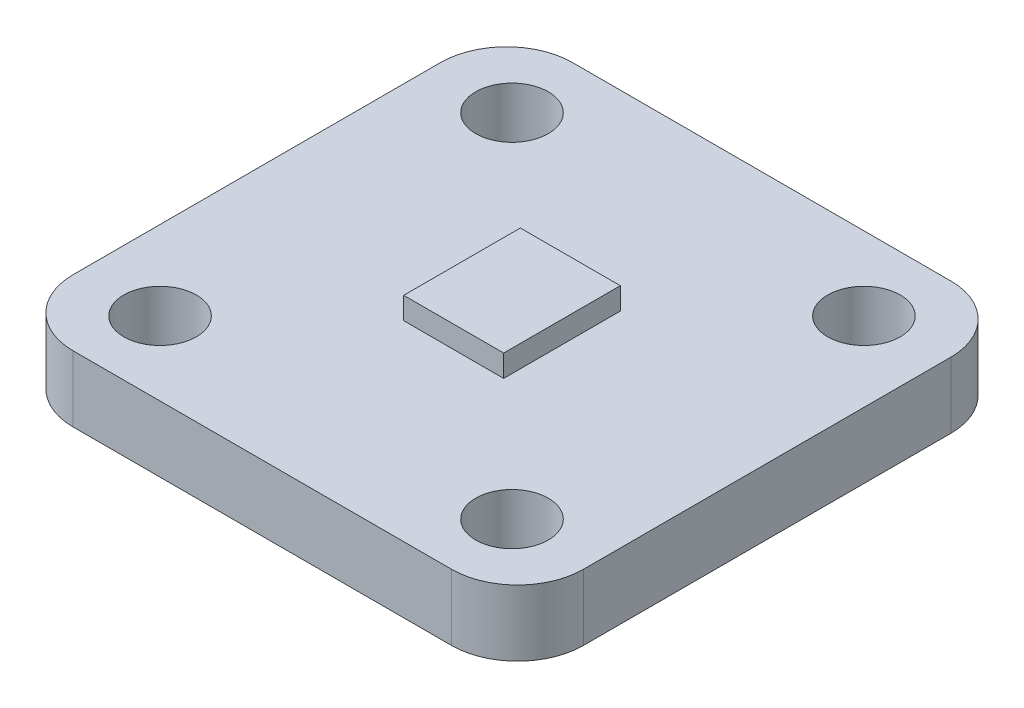
ISO-10303-21;
HEADER;
FILE_DESCRIPTION(('STEP AP214'),'2;1');
FILE_NAME('part.step','',(''),(''),'','','');
FILE_SCHEMA(('AUTOMOTIVE_DESIGN { 1 0 10303 214 1 1 1 1 }'));
ENDSEC;
DATA;
#1=APPLICATION_CONTEXT('core data for automotive mechanical design processes');
#2=APPLICATION_PROTOCOL_DEFINITION('international standard','automotive_design',2000,#1);
#3=PRODUCT_CONTEXT('',#1,'mechanical');
#4=PRODUCT('Part','Part','',(#3));
#5=PRODUCT_RELATED_PRODUCT_CATEGORY('part','',(#4));
#6=PRODUCT_DEFINITION_FORMATION('','',#4);
#7=PRODUCT_DEFINITION_CONTEXT('part definition',#1,'design');
#8=PRODUCT_DEFINITION('design','',#6,#7);
#9=PRODUCT_DEFINITION_SHAPE('','',#8);
#10=(LENGTH_UNIT() NAMED_UNIT(*) SI_UNIT(.MILLI.,.METRE.));
#11=(NAMED_UNIT(*) PLANE_ANGLE_UNIT() SI_UNIT($,.RADIAN.));
#12=(NAMED_UNIT(*) SI_UNIT($,.STERADIAN.) SOLID_ANGLE_UNIT());
#13=UNCERTAINTY_MEASURE_WITH_UNIT(LENGTH_MEASURE(1.E-05),#10,'distance_accuracy_value','');
#14=(GEOMETRIC_REPRESENTATION_CONTEXT(3) GLOBAL_UNCERTAINTY_ASSIGNED_CONTEXT((#13)) GLOBAL_UNIT_ASSIGNED_CONTEXT((#10,
#11,#12)) REPRESENTATION_CONTEXT('',''));
#15=CARTESIAN_POINT('',(0.,0.,0.));
#16=DIRECTION('',(0.,0.,1.));
#17=DIRECTION('',(1.,0.,0.));
#18=AXIS2_PLACEMENT_3D('',#15,#16,#17);
#19=CARTESIAN_POINT('',(0.,3.,0.));
#20=DIRECTION('',(0.,1.,0.));
#21=DIRECTION('',(0.,0.,1.));
#22=AXIS2_PLACEMENT_3D('',#19,#20,#21);
#23=PLANE('',#22);
#24=CARTESIAN_POINT('',(8.,3.,8.));
#25=DIRECTION('',(0.,1.,0.));
#26=DIRECTION('',(0.,0.,1.));
#27=AXIS2_PLACEMENT_3D('',#24,#25,#26);
#28=CIRCLE('',#27,1.65);
#29=CARTESIAN_POINT('',(8.,3.,9.65));
#30=VERTEX_POINT('',#29);
#31=EDGE_CURVE('E171',#30,#30,#28,.T.);
#32=ORIENTED_EDGE('',*,*,#31,.F.);
#33=EDGE_LOOP('',(#32));
#34=FACE_BOUND('',#33,.T.);
#35=CARTESIAN_POINT('',(-8.,3.,-8.));
#36=DIRECTION('',(0.,1.,0.));
#37=DIRECTION('',(0.,0.,1.));
#38=AXIS2_PLACEMENT_3D('',#35,#36,#37);
#39=CIRCLE('',#38,1.65);
#40=CARTESIAN_POINT('',(-8.,3.,-6.35));
#41=VERTEX_POINT('',#40);
#42=EDGE_CURVE('E187',#41,#41,#39,.T.);
#43=ORIENTED_EDGE('',*,*,#42,.F.);
#44=EDGE_LOOP('',(#43));
#45=FACE_BOUND('',#44,.T.);
#46=DIRECTION('',(-1.,0.,0.));
#47=VECTOR('',#46,1.);
#48=CARTESIAN_POINT('',(-11.6,3.,-11.35));
#49=LINE('',#48,#47);
#50=CARTESIAN_POINT('',(8.59999999999999,3.,-11.35));
#51=VERTEX_POINT('',#50);
#52=CARTESIAN_POINT('',(-8.6,3.,-11.35));
#53=VERTEX_POINT('',#52);
#54=EDGE_CURVE('E199',#51,#53,#49,.T.);
#55=ORIENTED_EDGE('',*,*,#54,.T.);
#56=CARTESIAN_POINT('',(-8.6,3.,-8.35));
#57=DIRECTION('',(0.,1.,0.));
#58=DIRECTION('',(0.,0.,1.));
#59=AXIS2_PLACEMENT_3D('',#56,#57,#58);
#60=CIRCLE('',#59,3.);
#61=CARTESIAN_POINT('',(-11.6,3.,-8.35));
#62=VERTEX_POINT('',#61);
#63=EDGE_CURVE('E259',#53,#62,#60,.T.);
#64=ORIENTED_EDGE('',*,*,#63,.T.);
#65=DIRECTION('',(0.,0.,1.));
#66=VECTOR('',#65,1.);
#67=CARTESIAN_POINT('',(-11.6,3.,-11.35));
#68=LINE('',#67,#66);
#69=CARTESIAN_POINT('',(-11.6,3.,8.35));
#70=VERTEX_POINT('',#69);
#71=EDGE_CURVE('E204',#62,#70,#68,.T.);
#72=ORIENTED_EDGE('',*,*,#71,.T.);
#73=CARTESIAN_POINT('',(-8.6,3.,8.35));
#74=DIRECTION('',(0.,1.,0.));
#75=DIRECTION('',(0.,0.,1.));
#76=AXIS2_PLACEMENT_3D('',#73,#74,#75);
#77=CIRCLE('',#76,3.);
#78=CARTESIAN_POINT('',(-8.6,3.,11.35));
#79=VERTEX_POINT('',#78);
#80=EDGE_CURVE('E250',#70,#79,#77,.T.);
#81=ORIENTED_EDGE('',*,*,#80,.T.);
#82=DIRECTION('',(1.,0.,0.));
#83=VECTOR('',#82,1.);
#84=CARTESIAN_POINT('',(-11.6,3.,11.35));
#85=LINE('',#84,#83);
#86=CARTESIAN_POINT('',(8.6,3.,11.35));
#87=VERTEX_POINT('',#86);
#88=EDGE_CURVE('E208',#79,#87,#85,.T.);
#89=ORIENTED_EDGE('',*,*,#88,.T.);
#90=CARTESIAN_POINT('',(8.6,3.,8.35));
#91=DIRECTION('',(0.,1.,0.));
#92=DIRECTION('',(0.,0.,1.));
#93=AXIS2_PLACEMENT_3D('',#90,#91,#92);
#94=CIRCLE('',#93,3.);
#95=CARTESIAN_POINT('',(11.6,3.,8.35));
#96=VERTEX_POINT('',#95);
#97=EDGE_CURVE('E253',#87,#96,#94,.T.);
#98=ORIENTED_EDGE('',*,*,#97,.T.);
#99=DIRECTION('',(0.,0.,-1.));
#100=VECTOR('',#99,1.);
#101=CARTESIAN_POINT('',(11.6,3.,-11.35));
#102=LINE('',#101,#100);
#103=CARTESIAN_POINT('',(11.6,3.,-8.35));
#104=VERTEX_POINT('',#103);
#105=EDGE_CURVE('E195',#96,#104,#102,.T.);
#106=ORIENTED_EDGE('',*,*,#105,.T.);
#107=CARTESIAN_POINT('',(8.59999999999999,3.,-8.35));
#108=DIRECTION('',(0.,1.,0.));
#109=DIRECTION('',(0.,0.,1.));
#110=AXIS2_PLACEMENT_3D('',#107,#108,#109);
#111=CIRCLE('',#110,3.);
#112=EDGE_CURVE('E256',#104,#51,#111,.T.);
#113=ORIENTED_EDGE('',*,*,#112,.T.);
#114=EDGE_LOOP('',(#55,#64,#72,#81,#89,#98,#106,#113));
#115=FACE_BOUND('',#114,.T.);
#116=CARTESIAN_POINT('',(8.,3.,-8.));
#117=DIRECTION('',(0.,1.,0.));
#118=DIRECTION('',(0.,0.,1.));
#119=AXIS2_PLACEMENT_3D('',#116,#117,#118);
#120=CIRCLE('',#119,1.65);
#121=CARTESIAN_POINT('',(8.,3.,-6.35));
#122=VERTEX_POINT('',#121);
#123=EDGE_CURVE('E179',#122,#122,#120,.T.);
#124=ORIENTED_EDGE('',*,*,#123,.F.);
#125=EDGE_LOOP('',(#124));
#126=FACE_BOUND('',#125,.T.);
#127=CARTESIAN_POINT('',(-8.,3.,8.));
#128=DIRECTION('',(0.,1.,0.));
#129=DIRECTION('',(0.,0.,1.));
#130=AXIS2_PLACEMENT_3D('',#127,#128,#129);
#131=CIRCLE('',#130,1.65);
#132=CARTESIAN_POINT('',(-8.,3.,9.65));
#133=VERTEX_POINT('',#132);
#134=EDGE_CURVE('E162',#133,#133,#131,.T.);
#135=ORIENTED_EDGE('',*,*,#134,.F.);
#136=EDGE_LOOP('',(#135));
#137=FACE_BOUND('',#136,.T.);
#138=DIRECTION('',(-1.,0.,0.));
#139=VECTOR('',#138,1.);
#140=CARTESIAN_POINT('',(-2.27197351403042,3.,-2.65063576636883));
#141=LINE('',#140,#139);
#142=CARTESIAN_POINT('',(2.27197351403042,3.,-2.65063576636883));
#143=VERTEX_POINT('',#142);
#144=CARTESIAN_POINT('',(-2.27197351403042,3.,-2.65063576636883));
#145=VERTEX_POINT('',#144);
#146=EDGE_CURVE('E427',#143,#145,#141,.T.);
#147=ORIENTED_EDGE('',*,*,#146,.F.);
#148=DIRECTION('',(0.,0.,-1.));
#149=VECTOR('',#148,1.);
#150=CARTESIAN_POINT('',(2.27197351403042,3.,-2.65063576636883));
#151=LINE('',#150,#149);
#152=CARTESIAN_POINT('',(2.27197351403042,3.,2.65063576636883));
#153=VERTEX_POINT('',#152);
#154=EDGE_CURVE('E154',#153,#143,#151,.T.);
#155=ORIENTED_EDGE('',*,*,#154,.F.);
#156=DIRECTION('',(1.,0.,0.));
#157=VECTOR('',#156,1.);
#158=CARTESIAN_POINT('',(-2.27197351403042,3.,2.65063576636883));
#159=LINE('',#158,#157);
#160=CARTESIAN_POINT('',(-2.27197351403042,3.,2.65063576636883));
#161=VERTEX_POINT('',#160);
#162=EDGE_CURVE('E150',#161,#153,#159,.T.);
#163=ORIENTED_EDGE('',*,*,#162,.F.);
#164=DIRECTION('',(0.,0.,1.));
#165=VECTOR('',#164,1.);
#166=CARTESIAN_POINT('',(-2.27197351403042,3.,-2.65063576636883));
#167=LINE('',#166,#165);
#168=EDGE_CURVE('E429',#145,#161,#167,.T.);
#169=ORIENTED_EDGE('',*,*,#168,.F.);
#170=EDGE_LOOP('',(#147,#155,#163,#169));
#171=FACE_BOUND('',#170,.T.);
#172=ADVANCED_FACE('F39',(#34,#45,#115,#126,#137,#171),#23,.T.);
#173=CARTESIAN_POINT('',(0.,0.,0.));
#174=DIRECTION('',(0.,1.,0.));
#175=DIRECTION('',(0.,0.,1.));
#176=AXIS2_PLACEMENT_3D('',#173,#174,#175);
#177=PLANE('',#176);
#178=DIRECTION('',(0.,0.,1.));
#179=VECTOR('',#178,1.);
#180=CARTESIAN_POINT('',(-11.6,0.,-11.35));
#181=LINE('',#180,#179);
#182=CARTESIAN_POINT('',(-11.6,0.,-8.35));
#183=VERTEX_POINT('',#182);
#184=CARTESIAN_POINT('',(-11.6,0.,8.35));
#185=VERTEX_POINT('',#184);
#186=EDGE_CURVE('E219',#183,#185,#181,.T.);
#187=ORIENTED_EDGE('',*,*,#186,.F.);
#188=CARTESIAN_POINT('',(-8.6,0.,-8.35));
#189=DIRECTION('',(0.,1.,0.));
#190=DIRECTION('',(0.,0.,1.));
#191=AXIS2_PLACEMENT_3D('',#188,#189,#190);
#192=CIRCLE('',#191,3.);
#193=CARTESIAN_POINT('',(-8.6,0.,-11.35));
#194=VERTEX_POINT('',#193);
#195=EDGE_CURVE('E240',#183,#194,#192,.F.);
#196=ORIENTED_EDGE('',*,*,#195,.T.);
#197=DIRECTION('',(-1.,0.,0.));
#198=VECTOR('',#197,1.);
#199=CARTESIAN_POINT('',(-11.6,0.,-11.35));
#200=LINE('',#199,#198);
#201=CARTESIAN_POINT('',(8.59999999999999,0.,-11.35));
#202=VERTEX_POINT('',#201);
#203=EDGE_CURVE('E215',#202,#194,#200,.T.);
#204=ORIENTED_EDGE('',*,*,#203,.F.);
#205=CARTESIAN_POINT('',(8.59999999999999,0.,-8.35));
#206=DIRECTION('',(0.,1.,0.));
#207=DIRECTION('',(0.,0.,1.));
#208=AXIS2_PLACEMENT_3D('',#205,#206,#207);
#209=CIRCLE('',#208,3.);
#210=CARTESIAN_POINT('',(11.6,0.,-8.35));
#211=VERTEX_POINT('',#210);
#212=EDGE_CURVE('E237',#202,#211,#209,.F.);
#213=ORIENTED_EDGE('',*,*,#212,.T.);
#214=DIRECTION('',(0.,0.,-1.));
#215=VECTOR('',#214,1.);
#216=CARTESIAN_POINT('',(11.6,0.,-11.35));
#217=LINE('',#216,#215);
#218=CARTESIAN_POINT('',(11.6,0.,8.35));
#219=VERTEX_POINT('',#218);
#220=EDGE_CURVE('E191',#219,#211,#217,.T.);
#221=ORIENTED_EDGE('',*,*,#220,.F.);
#222=CARTESIAN_POINT('',(8.6,0.,8.35));
#223=DIRECTION('',(0.,1.,0.));
#224=DIRECTION('',(0.,0.,1.));
#225=AXIS2_PLACEMENT_3D('',#222,#223,#224);
#226=CIRCLE('',#225,3.);
#227=CARTESIAN_POINT('',(8.6,0.,11.35));
#228=VERTEX_POINT('',#227);
#229=EDGE_CURVE('E234',#219,#228,#226,.F.);
#230=ORIENTED_EDGE('',*,*,#229,.T.);
#231=DIRECTION('',(1.,0.,0.));
#232=VECTOR('',#231,1.);
#233=CARTESIAN_POINT('',(-11.6,0.,11.35));
#234=LINE('',#233,#232);
#235=CARTESIAN_POINT('',(-8.6,0.,11.35));
#236=VERTEX_POINT('',#235);
#237=EDGE_CURVE('E200',#236,#228,#234,.T.);
#238=ORIENTED_EDGE('',*,*,#237,.F.);
#239=CARTESIAN_POINT('',(-8.6,0.,8.35));
#240=DIRECTION('',(0.,1.,0.));
#241=DIRECTION('',(0.,0.,1.));
#242=AXIS2_PLACEMENT_3D('',#239,#240,#241);
#243=CIRCLE('',#242,3.);
#244=EDGE_CURVE('E231',#236,#185,#243,.F.);
#245=ORIENTED_EDGE('',*,*,#244,.T.);
#246=EDGE_LOOP('',(#187,#196,#204,#213,#221,#230,#238,#245));
#247=FACE_BOUND('',#246,.T.);
#248=CARTESIAN_POINT('',(-8.,0.,-8.));
#249=DIRECTION('',(0.,1.,0.));
#250=DIRECTION('',(0.,0.,1.));
#251=AXIS2_PLACEMENT_3D('',#248,#249,#250);
#252=CIRCLE('',#251,1.65);
#253=CARTESIAN_POINT('',(-8.,0.,-6.35));
#254=VERTEX_POINT('',#253);
#255=EDGE_CURVE('E183',#254,#254,#252,.T.);
#256=ORIENTED_EDGE('',*,*,#255,.T.);
#257=EDGE_LOOP('',(#256));
#258=FACE_BOUND('',#257,.T.);
#259=CARTESIAN_POINT('',(8.,0.,-8.));
#260=DIRECTION('',(0.,1.,0.));
#261=DIRECTION('',(0.,0.,1.));
#262=AXIS2_PLACEMENT_3D('',#259,#260,#261);
#263=CIRCLE('',#262,1.65);
#264=CARTESIAN_POINT('',(8.,0.,-6.35));
#265=VERTEX_POINT('',#264);
#266=EDGE_CURVE('E175',#265,#265,#263,.T.);
#267=ORIENTED_EDGE('',*,*,#266,.T.);
#268=EDGE_LOOP('',(#267));
#269=FACE_BOUND('',#268,.T.);
#270=CARTESIAN_POINT('',(8.,0.,8.));
#271=DIRECTION('',(0.,1.,0.));
#272=DIRECTION('',(0.,0.,1.));
#273=AXIS2_PLACEMENT_3D('',#270,#271,#272);
#274=CIRCLE('',#273,1.65);
#275=CARTESIAN_POINT('',(8.,0.,9.65));
#276=VERTEX_POINT('',#275);
#277=EDGE_CURVE('E169',#276,#276,#274,.T.);
#278=ORIENTED_EDGE('',*,*,#277,.T.);
#279=EDGE_LOOP('',(#278));
#280=FACE_BOUND('',#279,.T.);
#281=CARTESIAN_POINT('',(-8.,0.,8.));
#282=DIRECTION('',(0.,1.,0.));
#283=DIRECTION('',(0.,0.,1.));
#284=AXIS2_PLACEMENT_3D('',#281,#282,#283);
#285=CIRCLE('',#284,1.65);
#286=CARTESIAN_POINT('',(-8.,0.,9.65));
#287=VERTEX_POINT('',#286);
#288=EDGE_CURVE('E157',#287,#287,#285,.T.);
#289=ORIENTED_EDGE('',*,*,#288,.T.);
#290=EDGE_LOOP('',(#289));
#291=FACE_BOUND('',#290,.T.);
#292=ADVANCED_FACE('F277',(#247,#258,#269,#280,#291),#177,.F.);
#293=CARTESIAN_POINT('',(11.6,3.,-11.35));
#294=DIRECTION('',(-1.,0.,0.));
#295=DIRECTION('',(0.,0.,1.));
#296=AXIS2_PLACEMENT_3D('',#293,#294,#295);
#297=PLANE('',#296);
#298=ORIENTED_EDGE('',*,*,#220,.T.);
#299=DIRECTION('',(0.,-1.,0.));
#300=VECTOR('',#299,1.);
#301=CARTESIAN_POINT('',(11.6,3.,-8.35));
#302=LINE('',#301,#300);
#303=EDGE_CURVE('E266',#211,#104,#302,.F.);
#304=ORIENTED_EDGE('',*,*,#303,.T.);
#305=ORIENTED_EDGE('',*,*,#105,.F.);
#306=DIRECTION('',(0.,-1.,0.));
#307=VECTOR('',#306,1.);
#308=CARTESIAN_POINT('',(11.6,3.,8.35));
#309=LINE('',#308,#307);
#310=EDGE_CURVE('E262',#96,#219,#309,.T.);
#311=ORIENTED_EDGE('',*,*,#310,.T.);
#312=EDGE_LOOP('',(#298,#304,#305,#311));
#313=FACE_BOUND('',#312,.T.);
#314=ADVANCED_FACE('F286',(#313),#297,.F.);
#315=CARTESIAN_POINT('',(-11.6,3.,-11.35));
#316=DIRECTION('',(0.,0.,1.));
#317=DIRECTION('',(1.,0.,0.));
#318=AXIS2_PLACEMENT_3D('',#315,#316,#317);
#319=PLANE('',#318);
#320=ORIENTED_EDGE('',*,*,#203,.T.);
#321=DIRECTION('',(0.,-1.,0.));
#322=VECTOR('',#321,1.);
#323=CARTESIAN_POINT('',(-8.6,3.,-11.35));
#324=LINE('',#323,#322);
#325=EDGE_CURVE('E247',#194,#53,#324,.F.);
#326=ORIENTED_EDGE('',*,*,#325,.T.);
#327=ORIENTED_EDGE('',*,*,#54,.F.);
#328=DIRECTION('',(0.,-1.,0.));
#329=VECTOR('',#328,1.);
#330=CARTESIAN_POINT('',(8.59999999999999,3.,-11.35));
#331=LINE('',#330,#329);
#332=EDGE_CURVE('E243',#51,#202,#331,.T.);
#333=ORIENTED_EDGE('',*,*,#332,.T.);
#334=EDGE_LOOP('',(#320,#326,#327,#333));
#335=FACE_BOUND('',#334,.T.);
#336=ADVANCED_FACE('F297',(#335),#319,.F.);
#337=CARTESIAN_POINT('',(-11.6,3.,-11.35));
#338=DIRECTION('',(1.,0.,0.));
#339=DIRECTION('',(0.,0.,-1.));
#340=AXIS2_PLACEMENT_3D('',#337,#338,#339);
#341=PLANE('',#340);
#342=ORIENTED_EDGE('',*,*,#71,.F.);
#343=DIRECTION('',(0.,-1.,0.));
#344=VECTOR('',#343,1.);
#345=CARTESIAN_POINT('',(-11.6,3.,-8.35));
#346=LINE('',#345,#344);
#347=EDGE_CURVE('E227',#62,#183,#346,.T.);
#348=ORIENTED_EDGE('',*,*,#347,.T.);
#349=ORIENTED_EDGE('',*,*,#186,.T.);
#350=DIRECTION('',(0.,-1.,0.));
#351=VECTOR('',#350,1.);
#352=CARTESIAN_POINT('',(-11.6,3.,8.35));
#353=LINE('',#352,#351);
#354=EDGE_CURVE('E211',#185,#70,#353,.F.);
#355=ORIENTED_EDGE('',*,*,#354,.T.);
#356=EDGE_LOOP('',(#342,#348,#349,#355));
#357=FACE_BOUND('',#356,.T.);
#358=ADVANCED_FACE('F305',(#357),#341,.F.);
#359=CARTESIAN_POINT('',(-11.6,3.,11.35));
#360=DIRECTION('',(0.,0.,-1.));
#361=DIRECTION('',(-1.,0.,0.));
#362=AXIS2_PLACEMENT_3D('',#359,#360,#361);
#363=PLANE('',#362);
#364=ORIENTED_EDGE('',*,*,#237,.T.);
#365=DIRECTION('',(0.,-1.,0.));
#366=VECTOR('',#365,1.);
#367=CARTESIAN_POINT('',(8.6,3.,11.35));
#368=LINE('',#367,#366);
#369=EDGE_CURVE('E11',#228,#87,#368,.F.);
#370=ORIENTED_EDGE('',*,*,#369,.T.);
#371=ORIENTED_EDGE('',*,*,#88,.F.);
#372=DIRECTION('',(0.,-1.,0.));
#373=VECTOR('',#372,1.);
#374=CARTESIAN_POINT('',(-8.6,3.,11.35));
#375=LINE('',#374,#373);
#376=EDGE_CURVE('E48',#79,#236,#375,.T.);
#377=ORIENTED_EDGE('',*,*,#376,.T.);
#378=EDGE_LOOP('',(#364,#370,#371,#377));
#379=FACE_BOUND('',#378,.T.);
#380=ADVANCED_FACE('F272',(#379),#363,.F.);
#381=CARTESIAN_POINT('',(-8.,3.,-8.));
#382=DIRECTION('',(0.,-1.,0.));
#383=DIRECTION('',(0.,0.,-1.));
#384=AXIS2_PLACEMENT_3D('',#381,#382,#383);
#385=CYLINDRICAL_SURFACE('',#384,1.65);
#386=ORIENTED_EDGE('',*,*,#42,.T.);
#387=EDGE_LOOP('',(#386));
#388=FACE_BOUND('',#387,.T.);
#389=ORIENTED_EDGE('',*,*,#255,.F.);
#390=EDGE_LOOP('',(#389));
#391=FACE_BOUND('',#390,.T.);
#392=ADVANCED_FACE('F323',(#388,#391),#385,.F.);
#393=CARTESIAN_POINT('',(8.,3.,-8.));
#394=DIRECTION('',(0.,-1.,0.));
#395=DIRECTION('',(0.,0.,-1.));
#396=AXIS2_PLACEMENT_3D('',#393,#394,#395);
#397=CYLINDRICAL_SURFACE('',#396,1.65);
#398=ORIENTED_EDGE('',*,*,#123,.T.);
#399=EDGE_LOOP('',(#398));
#400=FACE_BOUND('',#399,.T.);
#401=ORIENTED_EDGE('',*,*,#266,.F.);
#402=EDGE_LOOP('',(#401));
#403=FACE_BOUND('',#402,.T.);
#404=ADVANCED_FACE('F405',(#400,#403),#397,.F.);
#405=CARTESIAN_POINT('',(8.,3.,8.));
#406=DIRECTION('',(0.,-1.,0.));
#407=DIRECTION('',(0.,0.,-1.));
#408=AXIS2_PLACEMENT_3D('',#405,#406,#407);
#409=CYLINDRICAL_SURFACE('',#408,1.65);
#410=ORIENTED_EDGE('',*,*,#31,.T.);
#411=EDGE_LOOP('',(#410));
#412=FACE_BOUND('',#411,.T.);
#413=ORIENTED_EDGE('',*,*,#277,.F.);
#414=EDGE_LOOP('',(#413));
#415=FACE_BOUND('',#414,.T.);
#416=ADVANCED_FACE('F402',(#412,#415),#409,.F.);
#417=CARTESIAN_POINT('',(-8.,3.,8.));
#418=DIRECTION('',(0.,-1.,0.));
#419=DIRECTION('',(0.,0.,-1.));
#420=AXIS2_PLACEMENT_3D('',#417,#418,#419);
#421=CYLINDRICAL_SURFACE('',#420,1.65);
#422=ORIENTED_EDGE('',*,*,#134,.T.);
#423=EDGE_LOOP('',(#422));
#424=FACE_BOUND('',#423,.T.);
#425=ORIENTED_EDGE('',*,*,#288,.F.);
#426=EDGE_LOOP('',(#425));
#427=FACE_BOUND('',#426,.T.);
#428=ADVANCED_FACE('F336',(#424,#427),#421,.F.);
#429=CARTESIAN_POINT('',(-8.6,3.,-8.35));
#430=DIRECTION('',(0.,-1.,0.));
#431=DIRECTION('',(0.,0.,-1.));
#432=AXIS2_PLACEMENT_3D('',#429,#430,#431);
#433=CYLINDRICAL_SURFACE('',#432,3.);
#434=ORIENTED_EDGE('',*,*,#63,.F.);
#435=ORIENTED_EDGE('',*,*,#325,.F.);
#436=ORIENTED_EDGE('',*,*,#195,.F.);
#437=ORIENTED_EDGE('',*,*,#347,.F.);
#438=EDGE_LOOP('',(#434,#435,#436,#437));
#439=FACE_BOUND('',#438,.T.);
#440=ADVANCED_FACE('F302',(#439),#433,.T.);
#441=CARTESIAN_POINT('',(8.59999999999999,3.,-8.35));
#442=DIRECTION('',(0.,-1.,0.));
#443=DIRECTION('',(0.,0.,-1.));
#444=AXIS2_PLACEMENT_3D('',#441,#442,#443);
#445=CYLINDRICAL_SURFACE('',#444,3.);
#446=ORIENTED_EDGE('',*,*,#112,.F.);
#447=ORIENTED_EDGE('',*,*,#303,.F.);
#448=ORIENTED_EDGE('',*,*,#212,.F.);
#449=ORIENTED_EDGE('',*,*,#332,.F.);
#450=EDGE_LOOP('',(#446,#447,#448,#449));
#451=FACE_BOUND('',#450,.T.);
#452=ADVANCED_FACE('F294',(#451),#445,.T.);
#453=CARTESIAN_POINT('',(8.6,3.,8.35));
#454=DIRECTION('',(0.,-1.,0.));
#455=DIRECTION('',(0.,0.,-1.));
#456=AXIS2_PLACEMENT_3D('',#453,#454,#455);
#457=CYLINDRICAL_SURFACE('',#456,3.);
#458=ORIENTED_EDGE('',*,*,#97,.F.);
#459=ORIENTED_EDGE('',*,*,#369,.F.);
#460=ORIENTED_EDGE('',*,*,#229,.F.);
#461=ORIENTED_EDGE('',*,*,#310,.F.);
#462=EDGE_LOOP('',(#458,#459,#460,#461));
#463=FACE_BOUND('',#462,.T.);
#464=ADVANCED_FACE('F283',(#463),#457,.T.);
#465=CARTESIAN_POINT('',(-8.6,3.,8.35));
#466=DIRECTION('',(0.,-1.,0.));
#467=DIRECTION('',(0.,0.,-1.));
#468=AXIS2_PLACEMENT_3D('',#465,#466,#467);
#469=CYLINDRICAL_SURFACE('',#468,3.);
#470=ORIENTED_EDGE('',*,*,#80,.F.);
#471=ORIENTED_EDGE('',*,*,#354,.F.);
#472=ORIENTED_EDGE('',*,*,#244,.F.);
#473=ORIENTED_EDGE('',*,*,#376,.F.);
#474=EDGE_LOOP('',(#470,#471,#472,#473));
#475=FACE_BOUND('',#474,.T.);
#476=ADVANCED_FACE('F41',(#475),#469,.T.);
#477=CARTESIAN_POINT('',(2.27197351403042,4.,-2.65063576636883));
#478=DIRECTION('',(-1.,0.,0.));
#479=DIRECTION('',(0.,0.,1.));
#480=AXIS2_PLACEMENT_3D('',#477,#478,#479);
#481=PLANE('',#480);
#482=ORIENTED_EDGE('',*,*,#154,.T.);
#483=DIRECTION('',(0.,-1.,0.));
#484=VECTOR('',#483,1.);
#485=CARTESIAN_POINT('',(2.27197351403042,4.,-2.65063576636883));
#486=LINE('',#485,#484);
#487=CARTESIAN_POINT('',(2.27197351403042,4.,-2.65063576636883));
#488=VERTEX_POINT('',#487);
#489=EDGE_CURVE('E133',#488,#143,#486,.T.);
#490=ORIENTED_EDGE('',*,*,#489,.F.);
#491=DIRECTION('',(0.,0.,-1.));
#492=VECTOR('',#491,1.);
#493=CARTESIAN_POINT('',(2.27197351403042,4.,-2.65063576636883));
#494=LINE('',#493,#492);
#495=CARTESIAN_POINT('',(2.27197351403042,4.,2.65063576636883));
#496=VERTEX_POINT('',#495);
#497=EDGE_CURVE('E141',#496,#488,#494,.T.);
#498=ORIENTED_EDGE('',*,*,#497,.F.);
#499=DIRECTION('',(0.,-1.,0.));
#500=VECTOR('',#499,1.);
#501=CARTESIAN_POINT('',(2.27197351403042,4.,2.65063576636883));
#502=LINE('',#501,#500);
#503=EDGE_CURVE('E440',#496,#153,#502,.T.);
#504=ORIENTED_EDGE('',*,*,#503,.T.);
#505=EDGE_LOOP('',(#482,#490,#498,#504));
#506=FACE_BOUND('',#505,.T.);
#507=ADVANCED_FACE('F152',(#506),#481,.F.);
#508=CARTESIAN_POINT('',(-2.27197351403042,4.,-2.65063576636883));
#509=DIRECTION('',(0.,0.,1.));
#510=DIRECTION('',(1.,0.,0.));
#511=AXIS2_PLACEMENT_3D('',#508,#509,#510);
#512=PLANE('',#511);
#513=ORIENTED_EDGE('',*,*,#146,.T.);
#514=DIRECTION('',(0.,-1.,0.));
#515=VECTOR('',#514,1.);
#516=CARTESIAN_POINT('',(-2.27197351403042,4.,-2.65063576636883));
#517=LINE('',#516,#515);
#518=CARTESIAN_POINT('',(-2.27197351403042,4.,-2.65063576636883));
#519=VERTEX_POINT('',#518);
#520=EDGE_CURVE('E136',#519,#145,#517,.T.);
#521=ORIENTED_EDGE('',*,*,#520,.F.);
#522=DIRECTION('',(-1.,0.,0.));
#523=VECTOR('',#522,1.);
#524=CARTESIAN_POINT('',(-2.27197351403042,4.,-2.65063576636883));
#525=LINE('',#524,#523);
#526=EDGE_CURVE('E129',#488,#519,#525,.T.);
#527=ORIENTED_EDGE('',*,*,#526,.F.);
#528=ORIENTED_EDGE('',*,*,#489,.T.);
#529=EDGE_LOOP('',(#513,#521,#527,#528));
#530=FACE_BOUND('',#529,.T.);
#531=ADVANCED_FACE('F131',(#530),#512,.F.);
#532=CARTESIAN_POINT('',(-2.27197351403042,4.,-2.65063576636883));
#533=DIRECTION('',(1.,0.,0.));
#534=DIRECTION('',(0.,0.,-1.));
#535=AXIS2_PLACEMENT_3D('',#532,#533,#534);
#536=PLANE('',#535);
#537=ORIENTED_EDGE('',*,*,#168,.T.);
#538=DIRECTION('',(0.,-1.,0.));
#539=VECTOR('',#538,1.);
#540=CARTESIAN_POINT('',(-2.27197351403042,4.,2.65063576636883));
#541=LINE('',#540,#539);
#542=CARTESIAN_POINT('',(-2.27197351403042,4.,2.65063576636883));
#543=VERTEX_POINT('',#542);
#544=EDGE_CURVE('E55',#543,#161,#541,.T.);
#545=ORIENTED_EDGE('',*,*,#544,.F.);
#546=DIRECTION('',(0.,0.,1.));
#547=VECTOR('',#546,1.);
#548=CARTESIAN_POINT('',(-2.27197351403042,4.,-2.65063576636883));
#549=LINE('',#548,#547);
#550=EDGE_CURVE('E140',#519,#543,#549,.T.);
#551=ORIENTED_EDGE('',*,*,#550,.F.);
#552=ORIENTED_EDGE('',*,*,#520,.T.);
#553=EDGE_LOOP('',(#537,#545,#551,#552));
#554=FACE_BOUND('',#553,.T.);
#555=ADVANCED_FACE('F370',(#554),#536,.F.);
#556=CARTESIAN_POINT('',(-2.27197351403042,4.,2.65063576636883));
#557=DIRECTION('',(0.,0.,-1.));
#558=DIRECTION('',(-1.,0.,0.));
#559=AXIS2_PLACEMENT_3D('',#556,#557,#558);
#560=PLANE('',#559);
#561=ORIENTED_EDGE('',*,*,#162,.T.);
#562=ORIENTED_EDGE('',*,*,#503,.F.);
#563=DIRECTION('',(1.,0.,0.));
#564=VECTOR('',#563,1.);
#565=CARTESIAN_POINT('',(-2.27197351403042,4.,2.65063576636883));
#566=LINE('',#565,#564);
#567=EDGE_CURVE('E145',#543,#496,#566,.T.);
#568=ORIENTED_EDGE('',*,*,#567,.F.);
#569=ORIENTED_EDGE('',*,*,#544,.T.);
#570=EDGE_LOOP('',(#561,#562,#568,#569));
#571=FACE_BOUND('',#570,.T.);
#572=ADVANCED_FACE('F379',(#571),#560,.F.);
#573=CARTESIAN_POINT('',(0.,4.,0.));
#574=DIRECTION('',(0.,1.,0.));
#575=DIRECTION('',(0.,0.,1.));
#576=AXIS2_PLACEMENT_3D('',#573,#574,#575);
#577=PLANE('',#576);
#578=ORIENTED_EDGE('',*,*,#497,.T.);
#579=ORIENTED_EDGE('',*,*,#526,.T.);
#580=ORIENTED_EDGE('',*,*,#550,.T.);
#581=ORIENTED_EDGE('',*,*,#567,.T.);
#582=EDGE_LOOP('',(#578,#579,#580,#581));
#583=FACE_BOUND('',#582,.T.);
#584=ADVANCED_FACE('F144',(#583),#577,.T.);
#585=CLOSED_SHELL('',(#172,#292,#314,#336,#358,#380,#392,#404,#416,#428,#440,#452,#464,#476,
#507,#531,#555,#572,#584));
#586=MANIFOLD_SOLID_BREP('B2',#585);
#587=ADVANCED_BREP_SHAPE_REPRESENTATION('',(#18,#586),#14);
#588=SHAPE_DEFINITION_REPRESENTATION(#9,#587);
ENDSEC;
END-ISO-10303-21;
